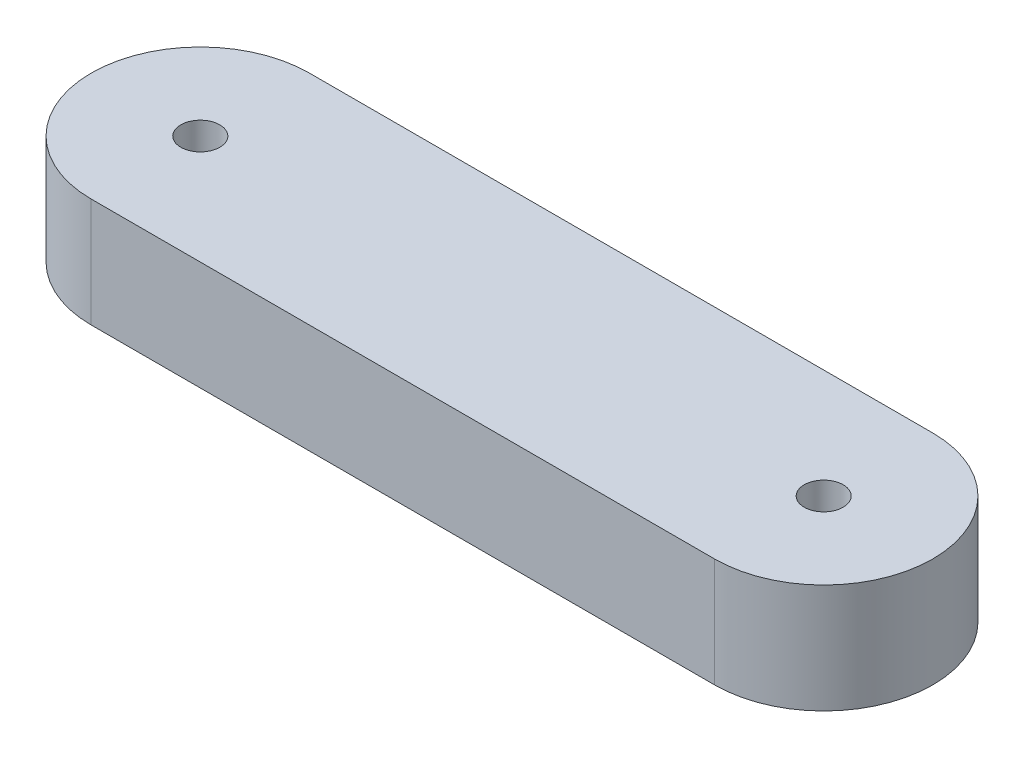
ISO-10303-21;
HEADER;
FILE_DESCRIPTION(('STEP AP214'),'2;1');
FILE_NAME('part.step','',(''),(''),'','','');
FILE_SCHEMA(('AUTOMOTIVE_DESIGN { 1 0 10303 214 1 1 1 1 }'));
ENDSEC;
DATA;
#1=APPLICATION_CONTEXT('core data for automotive mechanical design processes');
#2=APPLICATION_PROTOCOL_DEFINITION('international standard','automotive_design',2000,#1);
#3=PRODUCT_CONTEXT('',#1,'mechanical');
#4=PRODUCT('Part','Part','',(#3));
#5=PRODUCT_RELATED_PRODUCT_CATEGORY('part','',(#4));
#6=PRODUCT_DEFINITION_FORMATION('','',#4);
#7=PRODUCT_DEFINITION_CONTEXT('part definition',#1,'design');
#8=PRODUCT_DEFINITION('design','',#6,#7);
#9=PRODUCT_DEFINITION_SHAPE('','',#8);
#10=(LENGTH_UNIT() NAMED_UNIT(*) SI_UNIT(.MILLI.,.METRE.));
#11=(NAMED_UNIT(*) PLANE_ANGLE_UNIT() SI_UNIT($,.RADIAN.));
#12=(NAMED_UNIT(*) SI_UNIT($,.STERADIAN.) SOLID_ANGLE_UNIT());
#13=UNCERTAINTY_MEASURE_WITH_UNIT(LENGTH_MEASURE(1.E-05),#10,'distance_accuracy_value','');
#14=(GEOMETRIC_REPRESENTATION_CONTEXT(3) GLOBAL_UNCERTAINTY_ASSIGNED_CONTEXT((#13)) GLOBAL_UNIT_ASSIGNED_CONTEXT((#10,
#11,#12)) REPRESENTATION_CONTEXT('',''));
#15=CARTESIAN_POINT('',(0.,0.,0.));
#16=DIRECTION('',(0.,0.,1.));
#17=DIRECTION('',(1.,0.,0.));
#18=AXIS2_PLACEMENT_3D('',#15,#16,#17);
#19=CARTESIAN_POINT('',(0.,21.,0.));
#20=DIRECTION('',(0.,1.,0.));
#21=DIRECTION('',(0.,0.,1.));
#22=AXIS2_PLACEMENT_3D('',#19,#20,#21);
#23=PLANE('',#22);
#24=CARTESIAN_POINT('',(0.,21.,0.));
#25=DIRECTION('',(0.,1.,0.));
#26=DIRECTION('',(0.,0.,1.));
#27=AXIS2_PLACEMENT_3D('',#24,#25,#26);
#28=CIRCLE('',#27,3.75);
#29=CARTESIAN_POINT('',(0.,21.,-3.75));
#30=VERTEX_POINT('',#29);
#31=EDGE_CURVE('E104',#30,#30,#28,.T.);
#32=ORIENTED_EDGE('',*,*,#31,.F.);
#33=EDGE_LOOP('',(#32));
#34=FACE_BOUND('',#33,.T.);
#35=CARTESIAN_POINT('',(0.,21.,0.));
#36=DIRECTION('',(0.,1.,0.));
#37=DIRECTION('',(0.,0.,1.));
#38=AXIS2_PLACEMENT_3D('',#35,#36,#37);
#39=CIRCLE('',#38,21.);
#40=CARTESIAN_POINT('',(0.,21.,-21.));
#41=VERTEX_POINT('',#40);
#42=CARTESIAN_POINT('',(0.,21.,21.));
#43=VERTEX_POINT('',#42);
#44=EDGE_CURVE('E89',#41,#43,#39,.T.);
#45=ORIENTED_EDGE('',*,*,#44,.T.);
#46=DIRECTION('',(1.,0.,0.));
#47=VECTOR('',#46,1.);
#48=CARTESIAN_POINT('',(0.,21.,21.));
#49=LINE('',#48,#47);
#50=CARTESIAN_POINT('',(120.,21.,21.));
#51=VERTEX_POINT('',#50);
#52=EDGE_CURVE('E84',#43,#51,#49,.T.);
#53=ORIENTED_EDGE('',*,*,#52,.T.);
#54=CARTESIAN_POINT('',(120.,21.,0.));
#55=DIRECTION('',(0.,1.,0.));
#56=DIRECTION('',(0.,0.,1.));
#57=AXIS2_PLACEMENT_3D('',#54,#55,#56);
#58=CIRCLE('',#57,21.);
#59=CARTESIAN_POINT('',(120.,21.,-21.));
#60=VERTEX_POINT('',#59);
#61=EDGE_CURVE('E87',#51,#60,#58,.T.);
#62=ORIENTED_EDGE('',*,*,#61,.T.);
#63=DIRECTION('',(-1.,0.,0.));
#64=VECTOR('',#63,1.);
#65=CARTESIAN_POINT('',(0.,21.,-21.));
#66=LINE('',#65,#64);
#67=EDGE_CURVE('E54',#60,#41,#66,.T.);
#68=ORIENTED_EDGE('',*,*,#67,.T.);
#69=EDGE_LOOP('',(#45,#53,#62,#68));
#70=FACE_BOUND('',#69,.T.);
#71=CARTESIAN_POINT('',(120.,21.,0.));
#72=DIRECTION('',(0.,1.,0.));
#73=DIRECTION('',(0.,0.,1.));
#74=AXIS2_PLACEMENT_3D('',#71,#72,#73);
#75=CIRCLE('',#74,3.75000000000001);
#76=CARTESIAN_POINT('',(120.,21.,-3.75000000000001));
#77=VERTEX_POINT('',#76);
#78=EDGE_CURVE('E119',#77,#77,#75,.T.);
#79=ORIENTED_EDGE('',*,*,#78,.F.);
#80=EDGE_LOOP('',(#79));
#81=FACE_BOUND('',#80,.T.);
#82=ADVANCED_FACE('F37',(#34,#70,#81),#23,.T.);
#83=CARTESIAN_POINT('',(0.,0.,0.));
#84=DIRECTION('',(0.,1.,0.));
#85=DIRECTION('',(0.,0.,1.));
#86=AXIS2_PLACEMENT_3D('',#83,#84,#85);
#87=PLANE('',#86);
#88=CARTESIAN_POINT('',(0.,0.,0.));
#89=DIRECTION('',(0.,1.,0.));
#90=DIRECTION('',(0.,0.,1.));
#91=AXIS2_PLACEMENT_3D('',#88,#89,#90);
#92=CIRCLE('',#91,21.);
#93=CARTESIAN_POINT('',(0.,0.,-21.));
#94=VERTEX_POINT('',#93);
#95=CARTESIAN_POINT('',(0.,0.,21.));
#96=VERTEX_POINT('',#95);
#97=EDGE_CURVE('E101',#94,#96,#92,.T.);
#98=ORIENTED_EDGE('',*,*,#97,.F.);
#99=DIRECTION('',(-1.,0.,0.));
#100=VECTOR('',#99,1.);
#101=CARTESIAN_POINT('',(0.,0.,-21.));
#102=LINE('',#101,#100);
#103=CARTESIAN_POINT('',(120.,0.,-21.));
#104=VERTEX_POINT('',#103);
#105=EDGE_CURVE('E77',#104,#94,#102,.T.);
#106=ORIENTED_EDGE('',*,*,#105,.F.);
#107=CARTESIAN_POINT('',(120.,0.,0.));
#108=DIRECTION('',(0.,1.,0.));
#109=DIRECTION('',(0.,0.,1.));
#110=AXIS2_PLACEMENT_3D('',#107,#108,#109);
#111=CIRCLE('',#110,21.);
#112=CARTESIAN_POINT('',(120.,0.,21.));
#113=VERTEX_POINT('',#112);
#114=EDGE_CURVE('E71',#113,#104,#111,.T.);
#115=ORIENTED_EDGE('',*,*,#114,.F.);
#116=DIRECTION('',(1.,0.,0.));
#117=VECTOR('',#116,1.);
#118=CARTESIAN_POINT('',(0.,0.,21.));
#119=LINE('',#118,#117);
#120=EDGE_CURVE('E93',#96,#113,#119,.T.);
#121=ORIENTED_EDGE('',*,*,#120,.F.);
#122=EDGE_LOOP('',(#98,#106,#115,#121));
#123=FACE_BOUND('',#122,.T.);
#124=CARTESIAN_POINT('',(0.,0.,0.));
#125=DIRECTION('',(0.,1.,0.));
#126=DIRECTION('',(0.,0.,1.));
#127=AXIS2_PLACEMENT_3D('',#124,#125,#126);
#128=CIRCLE('',#127,3.75);
#129=CARTESIAN_POINT('',(0.,0.,-3.75));
#130=VERTEX_POINT('',#129);
#131=EDGE_CURVE('E116',#130,#130,#128,.T.);
#132=ORIENTED_EDGE('',*,*,#131,.T.);
#133=EDGE_LOOP('',(#132));
#134=FACE_BOUND('',#133,.T.);
#135=CARTESIAN_POINT('',(120.,0.,0.));
#136=DIRECTION('',(0.,1.,0.));
#137=DIRECTION('',(0.,0.,1.));
#138=AXIS2_PLACEMENT_3D('',#135,#136,#137);
#139=CIRCLE('',#138,3.75000000000001);
#140=CARTESIAN_POINT('',(120.,0.,-3.75000000000001));
#141=VERTEX_POINT('',#140);
#142=EDGE_CURVE('E122',#141,#141,#139,.T.);
#143=ORIENTED_EDGE('',*,*,#142,.T.);
#144=EDGE_LOOP('',(#143));
#145=FACE_BOUND('',#144,.T.);
#146=ADVANCED_FACE('F112',(#123,#134,#145),#87,.F.);
#147=CARTESIAN_POINT('',(0.,21.,0.));
#148=DIRECTION('',(0.,-1.,0.));
#149=DIRECTION('',(0.,0.,-1.));
#150=AXIS2_PLACEMENT_3D('',#147,#148,#149);
#151=CYLINDRICAL_SURFACE('',#150,21.);
#152=ORIENTED_EDGE('',*,*,#97,.T.);
#153=DIRECTION('',(0.,-1.,0.));
#154=VECTOR('',#153,1.);
#155=CARTESIAN_POINT('',(0.,21.,21.));
#156=LINE('',#155,#154);
#157=EDGE_CURVE('E11',#43,#96,#156,.T.);
#158=ORIENTED_EDGE('',*,*,#157,.F.);
#159=ORIENTED_EDGE('',*,*,#44,.F.);
#160=DIRECTION('',(0.,-1.,0.));
#161=VECTOR('',#160,1.);
#162=CARTESIAN_POINT('',(0.,21.,-21.));
#163=LINE('',#162,#161);
#164=EDGE_CURVE('E97',#41,#94,#163,.T.);
#165=ORIENTED_EDGE('',*,*,#164,.T.);
#166=EDGE_LOOP('',(#152,#158,#159,#165));
#167=FACE_BOUND('',#166,.T.);
#168=ADVANCED_FACE('F39',(#167),#151,.T.);
#169=CARTESIAN_POINT('',(0.,21.,21.));
#170=DIRECTION('',(0.,0.,-1.));
#171=DIRECTION('',(-1.,0.,0.));
#172=AXIS2_PLACEMENT_3D('',#169,#170,#171);
#173=PLANE('',#172);
#174=ORIENTED_EDGE('',*,*,#120,.T.);
#175=DIRECTION('',(0.,-1.,0.));
#176=VECTOR('',#175,1.);
#177=CARTESIAN_POINT('',(120.,21.,21.));
#178=LINE('',#177,#176);
#179=EDGE_CURVE('E46',#51,#113,#178,.T.);
#180=ORIENTED_EDGE('',*,*,#179,.F.);
#181=ORIENTED_EDGE('',*,*,#52,.F.);
#182=ORIENTED_EDGE('',*,*,#157,.T.);
#183=EDGE_LOOP('',(#174,#180,#181,#182));
#184=FACE_BOUND('',#183,.T.);
#185=ADVANCED_FACE('F92',(#184),#173,.F.);
#186=CARTESIAN_POINT('',(120.,21.,0.));
#187=DIRECTION('',(0.,-1.,0.));
#188=DIRECTION('',(0.,0.,-1.));
#189=AXIS2_PLACEMENT_3D('',#186,#187,#188);
#190=CYLINDRICAL_SURFACE('',#189,21.);
#191=ORIENTED_EDGE('',*,*,#114,.T.);
#192=DIRECTION('',(0.,-1.,0.));
#193=VECTOR('',#192,1.);
#194=CARTESIAN_POINT('',(120.,21.,-21.));
#195=LINE('',#194,#193);
#196=EDGE_CURVE('E94',#60,#104,#195,.T.);
#197=ORIENTED_EDGE('',*,*,#196,.F.);
#198=ORIENTED_EDGE('',*,*,#61,.F.);
#199=ORIENTED_EDGE('',*,*,#179,.T.);
#200=EDGE_LOOP('',(#191,#197,#198,#199));
#201=FACE_BOUND('',#200,.T.);
#202=ADVANCED_FACE('F95',(#201),#190,.T.);
#203=CARTESIAN_POINT('',(0.,21.,-21.));
#204=DIRECTION('',(0.,0.,1.));
#205=DIRECTION('',(1.,0.,0.));
#206=AXIS2_PLACEMENT_3D('',#203,#204,#205);
#207=PLANE('',#206);
#208=ORIENTED_EDGE('',*,*,#105,.T.);
#209=ORIENTED_EDGE('',*,*,#164,.F.);
#210=ORIENTED_EDGE('',*,*,#67,.F.);
#211=ORIENTED_EDGE('',*,*,#196,.T.);
#212=EDGE_LOOP('',(#208,#209,#210,#211));
#213=FACE_BOUND('',#212,.T.);
#214=ADVANCED_FACE('F109',(#213),#207,.F.);
#215=CARTESIAN_POINT('',(0.,21.,0.));
#216=DIRECTION('',(0.,-1.,0.));
#217=DIRECTION('',(0.,0.,-1.));
#218=AXIS2_PLACEMENT_3D('',#215,#216,#217);
#219=CYLINDRICAL_SURFACE('',#218,3.75);
#220=CARTESIAN_POINT('',(0.,21.,-3.75));
#221=CARTESIAN_POINT('',(0.,20.78125,-3.75));
#222=CARTESIAN_POINT('',(0.,20.5625,-3.75));
#223=CARTESIAN_POINT('',(0.,20.125,-3.75));
#224=CARTESIAN_POINT('',(0.,19.90625,-3.75));
#225=CARTESIAN_POINT('',(0.,19.46875,-3.75));
#226=CARTESIAN_POINT('',(0.,19.25,-3.75));
#227=CARTESIAN_POINT('',(0.,18.8125,-3.75));
#228=CARTESIAN_POINT('',(0.,18.59375,-3.75));
#229=CARTESIAN_POINT('',(0.,18.15625,-3.75));
#230=CARTESIAN_POINT('',(0.,17.9375,-3.75));
#231=CARTESIAN_POINT('',(0.,17.5,-3.75));
#232=CARTESIAN_POINT('',(0.,17.28125,-3.75));
#233=CARTESIAN_POINT('',(0.,16.84375,-3.75));
#234=CARTESIAN_POINT('',(0.,16.625,-3.75));
#235=CARTESIAN_POINT('',(0.,16.1875,-3.75));
#236=CARTESIAN_POINT('',(0.,15.96875,-3.75));
#237=CARTESIAN_POINT('',(0.,15.53125,-3.75));
#238=CARTESIAN_POINT('',(0.,15.3125,-3.75));
#239=CARTESIAN_POINT('',(0.,14.875,-3.75));
#240=CARTESIAN_POINT('',(0.,14.65625,-3.75));
#241=CARTESIAN_POINT('',(0.,14.21875,-3.75));
#242=CARTESIAN_POINT('',(0.,14.,-3.75));
#243=CARTESIAN_POINT('',(0.,13.5625,-3.75));
#244=CARTESIAN_POINT('',(0.,13.34375,-3.75));
#245=CARTESIAN_POINT('',(0.,12.90625,-3.75));
#246=CARTESIAN_POINT('',(0.,12.6875,-3.75));
#247=CARTESIAN_POINT('',(0.,12.25,-3.75));
#248=CARTESIAN_POINT('',(0.,12.03125,-3.75));
#249=CARTESIAN_POINT('',(0.,11.59375,-3.75));
#250=CARTESIAN_POINT('',(0.,11.375,-3.75));
#251=CARTESIAN_POINT('',(0.,10.9375,-3.75));
#252=CARTESIAN_POINT('',(0.,10.71875,-3.75));
#253=CARTESIAN_POINT('',(0.,10.28125,-3.75));
#254=CARTESIAN_POINT('',(0.,10.0625,-3.75));
#255=CARTESIAN_POINT('',(0.,9.625,-3.75));
#256=CARTESIAN_POINT('',(0.,9.40625,-3.75));
#257=CARTESIAN_POINT('',(0.,8.96875,-3.75));
#258=CARTESIAN_POINT('',(0.,8.75,-3.75));
#259=CARTESIAN_POINT('',(0.,8.3125,-3.75));
#260=CARTESIAN_POINT('',(0.,8.09375,-3.75));
#261=CARTESIAN_POINT('',(0.,7.65625,-3.75));
#262=CARTESIAN_POINT('',(0.,7.4375,-3.75));
#263=CARTESIAN_POINT('',(0.,7.,-3.75));
#264=CARTESIAN_POINT('',(0.,6.78125,-3.75));
#265=CARTESIAN_POINT('',(0.,6.34375,-3.75));
#266=CARTESIAN_POINT('',(0.,6.125,-3.75));
#267=CARTESIAN_POINT('',(0.,5.6875,-3.75));
#268=CARTESIAN_POINT('',(0.,5.46875,-3.75));
#269=CARTESIAN_POINT('',(0.,5.03125,-3.75));
#270=CARTESIAN_POINT('',(0.,4.8125,-3.75));
#271=CARTESIAN_POINT('',(0.,4.375,-3.75));
#272=CARTESIAN_POINT('',(0.,4.15625,-3.75));
#273=CARTESIAN_POINT('',(0.,3.71875,-3.75));
#274=CARTESIAN_POINT('',(0.,3.5,-3.75));
#275=CARTESIAN_POINT('',(0.,3.0625,-3.75));
#276=CARTESIAN_POINT('',(0.,2.84375,-3.75));
#277=CARTESIAN_POINT('',(0.,2.40625,-3.75));
#278=CARTESIAN_POINT('',(0.,2.1875,-3.75));
#279=CARTESIAN_POINT('',(0.,1.75,-3.75));
#280=CARTESIAN_POINT('',(0.,1.53125,-3.75));
#281=CARTESIAN_POINT('',(0.,1.09375,-3.75));
#282=CARTESIAN_POINT('',(0.,0.875000000000001,-3.75));
#283=CARTESIAN_POINT('',(0.,0.4375,-3.75));
#284=CARTESIAN_POINT('',(0.,0.21875,-3.75));
#285=CARTESIAN_POINT('',(0.,0.,-3.75));
#286=B_SPLINE_CURVE_WITH_KNOTS('',3,(#220,#221,#222,#223,#224,#225,#226,#227,#228,#229,#230,
#231,#232,#233,#234,#235,#236,#237,#238,#239,#240,#241,#242,#243,#244,#245,#246,#247,#248,#249,
#250,#251,#252,#253,#254,#255,#256,#257,#258,#259,#260,#261,#262,#263,#264,#265,#266,#267,#268,
#269,#270,#271,#272,#273,#274,#275,#276,#277,#278,#279,#280,#281,#282,#283,#284,#285),
.UNSPECIFIED.,.F.,.F.,(4,2,2,2,2,2,2,2,2,2,2,2,2,2,2,2,2,2,2,2,2,2,2,2,2,2,2,2,2,2,2,2,4),(0.,
0.656250000000001,1.3125,1.96875,2.625,3.28125,3.9375,4.59375,5.25,5.90625,6.5625,7.21875,7.875,
8.53125,9.1875,9.84375,10.5,11.15625,11.8125,12.46875,13.125,13.78125,14.4375,15.09375,15.75,
16.40625,17.0625,17.71875,18.375,19.03125,19.6875,20.34375,21.),.UNSPECIFIED.);
#287=EDGE_CURVE('BSEAM139',#30,#130,#286,.T.);
#288=ORIENTED_EDGE('',*,*,#31,.T.);
#289=ORIENTED_EDGE('',*,*,#131,.F.);
#290=ORIENTED_EDGE('',*,*,#287,.T.);
#291=ORIENTED_EDGE('',*,*,#287,.F.);
#292=EDGE_LOOP('',(#288,#290,#289,#291));
#293=FACE_BOUND('',#292,.T.);
#294=ADVANCED_FACE('F139',(#293),#219,.F.);
#295=CARTESIAN_POINT('',(120.,21.,0.));
#296=DIRECTION('',(0.,-1.,0.));
#297=DIRECTION('',(0.,0.,-1.));
#298=AXIS2_PLACEMENT_3D('',#295,#296,#297);
#299=CYLINDRICAL_SURFACE('',#298,3.75000000000001);
#300=CARTESIAN_POINT('',(120.,21.,-3.75000000000001));
#301=CARTESIAN_POINT('',(120.,20.78125,-3.75000000000001));
#302=CARTESIAN_POINT('',(120.,20.5625,-3.75000000000001));
#303=CARTESIAN_POINT('',(120.,20.125,-3.75000000000001));
#304=CARTESIAN_POINT('',(120.,19.90625,-3.75000000000001));
#305=CARTESIAN_POINT('',(120.,19.46875,-3.75000000000001));
#306=CARTESIAN_POINT('',(120.,19.25,-3.75000000000001));
#307=CARTESIAN_POINT('',(120.,18.8125,-3.75000000000001));
#308=CARTESIAN_POINT('',(120.,18.59375,-3.75000000000001));
#309=CARTESIAN_POINT('',(120.,18.15625,-3.75000000000001));
#310=CARTESIAN_POINT('',(120.,17.9375,-3.75000000000001));
#311=CARTESIAN_POINT('',(120.,17.5,-3.75000000000001));
#312=CARTESIAN_POINT('',(120.,17.28125,-3.75000000000001));
#313=CARTESIAN_POINT('',(120.,16.84375,-3.75000000000001));
#314=CARTESIAN_POINT('',(120.,16.625,-3.75000000000001));
#315=CARTESIAN_POINT('',(120.,16.1875,-3.75000000000001));
#316=CARTESIAN_POINT('',(120.,15.96875,-3.75000000000001));
#317=CARTESIAN_POINT('',(120.,15.53125,-3.75000000000001));
#318=CARTESIAN_POINT('',(120.,15.3125,-3.75000000000001));
#319=CARTESIAN_POINT('',(120.,14.875,-3.75000000000001));
#320=CARTESIAN_POINT('',(120.,14.65625,-3.75000000000001));
#321=CARTESIAN_POINT('',(120.,14.21875,-3.75000000000001));
#322=CARTESIAN_POINT('',(120.,14.,-3.75000000000001));
#323=CARTESIAN_POINT('',(120.,13.5625,-3.75000000000001));
#324=CARTESIAN_POINT('',(120.,13.34375,-3.75000000000001));
#325=CARTESIAN_POINT('',(120.,12.90625,-3.75000000000001));
#326=CARTESIAN_POINT('',(120.,12.6875,-3.75000000000001));
#327=CARTESIAN_POINT('',(120.,12.25,-3.75000000000001));
#328=CARTESIAN_POINT('',(120.,12.03125,-3.75000000000001));
#329=CARTESIAN_POINT('',(120.,11.59375,-3.75000000000001));
#330=CARTESIAN_POINT('',(120.,11.375,-3.75000000000001));
#331=CARTESIAN_POINT('',(120.,10.9375,-3.75000000000001));
#332=CARTESIAN_POINT('',(120.,10.71875,-3.75000000000001));
#333=CARTESIAN_POINT('',(120.,10.28125,-3.75000000000001));
#334=CARTESIAN_POINT('',(120.,10.0625,-3.75000000000001));
#335=CARTESIAN_POINT('',(120.,9.625,-3.75000000000001));
#336=CARTESIAN_POINT('',(120.,9.40625,-3.75000000000001));
#337=CARTESIAN_POINT('',(120.,8.96875,-3.75000000000001));
#338=CARTESIAN_POINT('',(120.,8.75,-3.75000000000001));
#339=CARTESIAN_POINT('',(120.,8.3125,-3.75000000000001));
#340=CARTESIAN_POINT('',(120.,8.09375,-3.75000000000001));
#341=CARTESIAN_POINT('',(120.,7.65625,-3.75000000000001));
#342=CARTESIAN_POINT('',(120.,7.4375,-3.75000000000001));
#343=CARTESIAN_POINT('',(120.,7.,-3.75000000000001));
#344=CARTESIAN_POINT('',(120.,6.78125,-3.75000000000001));
#345=CARTESIAN_POINT('',(120.,6.34375,-3.75000000000001));
#346=CARTESIAN_POINT('',(120.,6.125,-3.75000000000001));
#347=CARTESIAN_POINT('',(120.,5.6875,-3.75000000000001));
#348=CARTESIAN_POINT('',(120.,5.46875,-3.75000000000001));
#349=CARTESIAN_POINT('',(120.,5.03125,-3.75000000000001));
#350=CARTESIAN_POINT('',(120.,4.8125,-3.75000000000001));
#351=CARTESIAN_POINT('',(120.,4.375,-3.75000000000001));
#352=CARTESIAN_POINT('',(120.,4.15625,-3.75000000000001));
#353=CARTESIAN_POINT('',(120.,3.71875,-3.75000000000001));
#354=CARTESIAN_POINT('',(120.,3.5,-3.75000000000001));
#355=CARTESIAN_POINT('',(120.,3.0625,-3.75000000000001));
#356=CARTESIAN_POINT('',(120.,2.84375,-3.75000000000001));
#357=CARTESIAN_POINT('',(120.,2.40625,-3.75000000000001));
#358=CARTESIAN_POINT('',(120.,2.1875,-3.75000000000001));
#359=CARTESIAN_POINT('',(120.,1.75,-3.75000000000001));
#360=CARTESIAN_POINT('',(120.,1.53125,-3.75000000000001));
#361=CARTESIAN_POINT('',(120.,1.09375,-3.75000000000001));
#362=CARTESIAN_POINT('',(120.,0.875000000000001,-3.75000000000001));
#363=CARTESIAN_POINT('',(120.,0.4375,-3.75000000000001));
#364=CARTESIAN_POINT('',(120.,0.21875,-3.75000000000001));
#365=CARTESIAN_POINT('',(120.,0.,-3.75000000000001));
#366=B_SPLINE_CURVE_WITH_KNOTS('',3,(#300,#301,#302,#303,#304,#305,#306,#307,#308,#309,#310,
#311,#312,#313,#314,#315,#316,#317,#318,#319,#320,#321,#322,#323,#324,#325,#326,#327,#328,#329,
#330,#331,#332,#333,#334,#335,#336,#337,#338,#339,#340,#341,#342,#343,#344,#345,#346,#347,#348,
#349,#350,#351,#352,#353,#354,#355,#356,#357,#358,#359,#360,#361,#362,#363,#364,#365),
.UNSPECIFIED.,.F.,.F.,(4,2,2,2,2,2,2,2,2,2,2,2,2,2,2,2,2,2,2,2,2,2,2,2,2,2,2,2,2,2,2,2,4),(0.,
0.656250000000001,1.3125,1.96875,2.625,3.28125,3.9375,4.59375,5.25,5.90625,6.5625,7.21875,7.875,
8.53125,9.1875,9.84375,10.5,11.15625,11.8125,12.46875,13.125,13.78125,14.4375,15.09375,15.75,
16.40625,17.0625,17.71875,18.375,19.03125,19.6875,20.34375,21.),.UNSPECIFIED.);
#367=EDGE_CURVE('BSEAM128',#77,#141,#366,.T.);
#368=ORIENTED_EDGE('',*,*,#78,.T.);
#369=ORIENTED_EDGE('',*,*,#142,.F.);
#370=ORIENTED_EDGE('',*,*,#367,.T.);
#371=ORIENTED_EDGE('',*,*,#367,.F.);
#372=EDGE_LOOP('',(#368,#370,#369,#371));
#373=FACE_BOUND('',#372,.T.);
#374=ADVANCED_FACE('F128',(#373),#299,.F.);
#375=CLOSED_SHELL('',(#82,#146,#168,#185,#202,#214,#294,#374));
#376=MANIFOLD_SOLID_BREP('B2',#375);
#377=ADVANCED_BREP_SHAPE_REPRESENTATION('',(#18,#376),#14);
#378=SHAPE_DEFINITION_REPRESENTATION(#9,#377);
ENDSEC;
END-ISO-10303-21;
